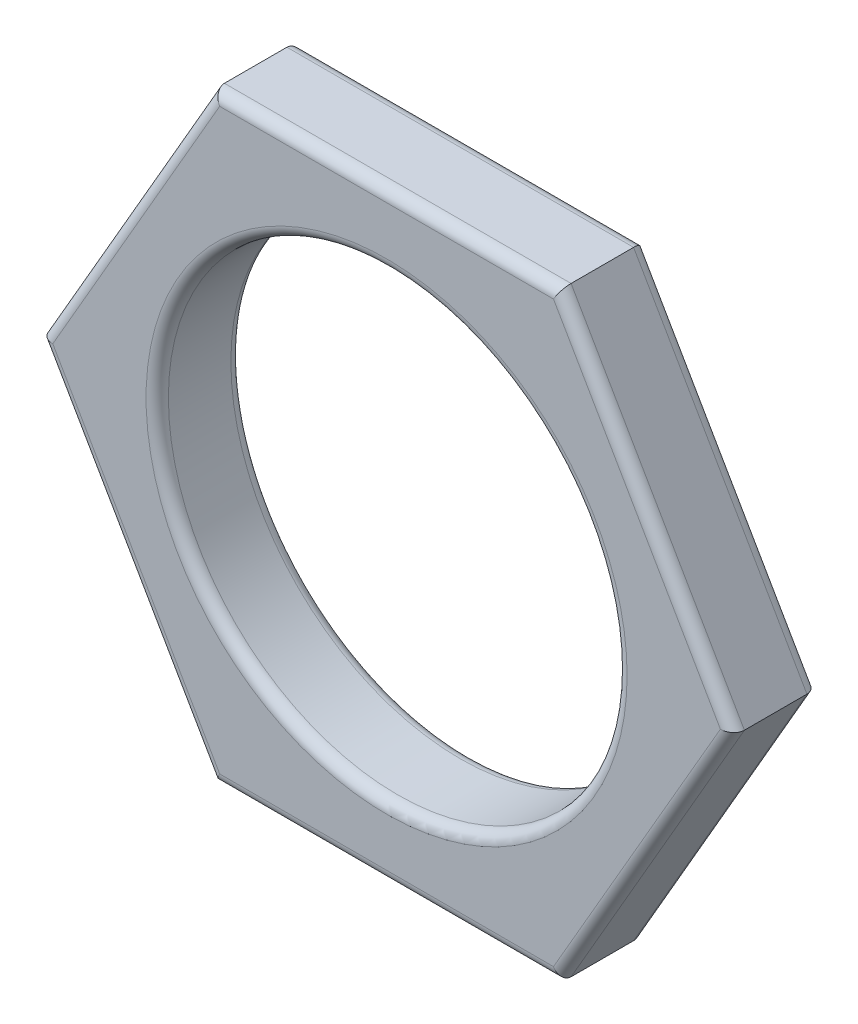
ISO-10303-21;
HEADER;
FILE_DESCRIPTION(('STEP AP214'),'2;1');
FILE_NAME('part.step','',(''),(''),'','','');
FILE_SCHEMA(('AUTOMOTIVE_DESIGN { 1 0 10303 214 1 1 1 1 }'));
ENDSEC;
DATA;
#1=APPLICATION_CONTEXT('core data for automotive mechanical design processes');
#2=APPLICATION_PROTOCOL_DEFINITION('international standard','automotive_design',2000,#1);
#3=PRODUCT_CONTEXT('',#1,'mechanical');
#4=PRODUCT('Part','Part','',(#3));
#5=PRODUCT_RELATED_PRODUCT_CATEGORY('part','',(#4));
#6=PRODUCT_DEFINITION_FORMATION('','',#4);
#7=PRODUCT_DEFINITION_CONTEXT('part definition',#1,'design');
#8=PRODUCT_DEFINITION('design','',#6,#7);
#9=PRODUCT_DEFINITION_SHAPE('','',#8);
#10=(LENGTH_UNIT() NAMED_UNIT(*) SI_UNIT(.MILLI.,.METRE.));
#11=(NAMED_UNIT(*) PLANE_ANGLE_UNIT() SI_UNIT($,.RADIAN.));
#12=(NAMED_UNIT(*) SI_UNIT($,.STERADIAN.) SOLID_ANGLE_UNIT());
#13=UNCERTAINTY_MEASURE_WITH_UNIT(LENGTH_MEASURE(1.E-05),#10,'distance_accuracy_value','');
#14=(GEOMETRIC_REPRESENTATION_CONTEXT(3) GLOBAL_UNCERTAINTY_ASSIGNED_CONTEXT((#13)) GLOBAL_UNIT_ASSIGNED_CONTEXT((#10,
#11,#12)) REPRESENTATION_CONTEXT('',''));
#15=CARTESIAN_POINT('',(0.,0.,0.));
#16=DIRECTION('',(0.,0.,1.));
#17=DIRECTION('',(1.,0.,0.));
#18=AXIS2_PLACEMENT_3D('',#15,#16,#17);
#19=CARTESIAN_POINT('',(0.,0.,1.9));
#20=DIRECTION('',(0.,0.,1.));
#21=DIRECTION('',(1.,0.,0.));
#22=AXIS2_PLACEMENT_3D('',#19,#20,#21);
#23=PLANE('',#22);
#24=CARTESIAN_POINT('',(0.,0.,1.9));
#25=DIRECTION('',(0.,0.,1.));
#26=DIRECTION('',(1.,0.,0.));
#27=AXIS2_PLACEMENT_3D('',#24,#25,#26);
#28=CIRCLE('',#27,10.775);
#29=CARTESIAN_POINT('',(10.775,0.,1.9));
#30=VERTEX_POINT('',#29);
#31=EDGE_CURVE('E11',#30,#30,#28,.F.);
#32=ORIENTED_EDGE('',*,*,#31,.T.);
#33=EDGE_LOOP('',(#32));
#34=FACE_BOUND('',#33,.T.);
#35=DIRECTION('',(-0.500000000000007,0.866025403784435,0.));
#36=VECTOR('',#35,1.);
#37=CARTESIAN_POINT('',(7.33234841870811,13.2,1.9));
#38=LINE('',#37,#36);
#39=CARTESIAN_POINT('',(14.9533719720113,1.03184664516418E-13,1.9));
#40=VERTEX_POINT('',#39);
#41=CARTESIAN_POINT('',(7.47668598600552,12.95,1.9));
#42=VERTEX_POINT('',#41);
#43=EDGE_CURVE('E51',#40,#42,#38,.T.);
#44=ORIENTED_EDGE('',*,*,#43,.T.);
#45=DIRECTION('',(-1.,0.,0.));
#46=VECTOR('',#45,1.);
#47=CARTESIAN_POINT('',(-7.76536112060061,12.9499999999999,1.9));
#48=LINE('',#47,#46);
#49=CARTESIAN_POINT('',(-7.4766859860058,12.9499999999999,1.9));
#50=VERTEX_POINT('',#49);
#51=EDGE_CURVE('E43',#42,#50,#48,.T.);
#52=ORIENTED_EDGE('',*,*,#51,.T.);
#53=DIRECTION('',(-0.499999999999995,-0.866025403784442,0.));
#54=VECTOR('',#53,1.);
#55=CARTESIAN_POINT('',(-15.0977095393087,-0.249999999999997,1.9));
#56=LINE('',#55,#54);
#57=CARTESIAN_POINT('',(-14.9533719720113,0.,1.9));
#58=VERTEX_POINT('',#57);
#59=EDGE_CURVE('E190',#50,#58,#56,.T.);
#60=ORIENTED_EDGE('',*,*,#59,.T.);
#61=DIRECTION('',(0.500000000000001,-0.866025403784438,0.));
#62=VECTOR('',#61,1.);
#63=CARTESIAN_POINT('',(-7.3323484187082,-13.2,1.9));
#64=LINE('',#63,#62);
#65=CARTESIAN_POINT('',(-7.47668598600561,-12.95,1.9));
#66=VERTEX_POINT('',#65);
#67=EDGE_CURVE('E192',#58,#66,#64,.T.);
#68=ORIENTED_EDGE('',*,*,#67,.T.);
#69=DIRECTION('',(1.,0.,0.));
#70=VECTOR('',#69,1.);
#71=CARTESIAN_POINT('',(7.76536112060052,-12.9499999999999,1.9));
#72=LINE('',#71,#70);
#73=CARTESIAN_POINT('',(7.4766859860057,-12.9499999999999,1.9));
#74=VERTEX_POINT('',#73);
#75=EDGE_CURVE('E194',#66,#74,#72,.T.);
#76=ORIENTED_EDGE('',*,*,#75,.T.);
#77=DIRECTION('',(0.499999999999995,0.866025403784442,0.));
#78=VECTOR('',#77,1.);
#79=CARTESIAN_POINT('',(15.0977095393087,0.250000000000108,1.9));
#80=LINE('',#79,#78);
#81=EDGE_CURVE('E56',#74,#40,#80,.T.);
#82=ORIENTED_EDGE('',*,*,#81,.T.);
#83=EDGE_LOOP('',(#44,#52,#60,#68,#76,#82));
#84=FACE_BOUND('',#83,.T.);
#85=ADVANCED_FACE('F34',(#34,#84),#23,.T.);
#86=CARTESIAN_POINT('',(0.,0.,-1.9));
#87=DIRECTION('',(0.,0.,1.));
#88=DIRECTION('',(1.,0.,0.));
#89=AXIS2_PLACEMENT_3D('',#86,#87,#88);
#90=PLANE('',#89);
#91=CARTESIAN_POINT('',(0.,0.,-1.9));
#92=DIRECTION('',(0.,0.,1.));
#93=DIRECTION('',(1.,0.,0.));
#94=AXIS2_PLACEMENT_3D('',#91,#92,#93);
#95=CIRCLE('',#94,10.775);
#96=CARTESIAN_POINT('',(10.775,0.,-1.9));
#97=VERTEX_POINT('',#96);
#98=EDGE_CURVE('E152',#97,#97,#95,.T.);
#99=ORIENTED_EDGE('',*,*,#98,.T.);
#100=EDGE_LOOP('',(#99));
#101=FACE_BOUND('',#100,.T.);
#102=DIRECTION('',(1.,0.,0.));
#103=VECTOR('',#102,1.);
#104=CARTESIAN_POINT('',(0.,-12.95,-1.9));
#105=LINE('',#104,#103);
#106=CARTESIAN_POINT('',(7.4766859860057,-12.9499999999999,-1.9));
#107=VERTEX_POINT('',#106);
#108=CARTESIAN_POINT('',(-7.47668598600561,-12.95,-1.9));
#109=VERTEX_POINT('',#108);
#110=EDGE_CURVE('E151',#107,#109,#105,.F.);
#111=ORIENTED_EDGE('',*,*,#110,.T.);
#112=DIRECTION('',(0.500000000000001,-0.866025403784438,0.));
#113=VECTOR('',#112,1.);
#114=CARTESIAN_POINT('',(-11.2150289790084,-6.475,-1.9));
#115=LINE('',#114,#113);
#116=CARTESIAN_POINT('',(-14.9533719720113,0.,-1.9));
#117=VERTEX_POINT('',#116);
#118=EDGE_CURVE('E130',#109,#117,#115,.F.);
#119=ORIENTED_EDGE('',*,*,#118,.T.);
#120=DIRECTION('',(-0.499999999999995,-0.866025403784442,0.));
#121=VECTOR('',#120,1.);
#122=CARTESIAN_POINT('',(-11.2150289790085,6.47499999999995,-1.9));
#123=LINE('',#122,#121);
#124=CARTESIAN_POINT('',(-7.4766859860058,12.9499999999999,-1.9));
#125=VERTEX_POINT('',#124);
#126=EDGE_CURVE('E140',#117,#125,#123,.F.);
#127=ORIENTED_EDGE('',*,*,#126,.T.);
#128=DIRECTION('',(-1.,0.,0.));
#129=VECTOR('',#128,1.);
#130=CARTESIAN_POINT('',(-1.34521381932275E-13,12.95,-1.9));
#131=LINE('',#130,#129);
#132=CARTESIAN_POINT('',(7.47668598600552,12.95,-1.9));
#133=VERTEX_POINT('',#132);
#134=EDGE_CURVE('E146',#125,#133,#131,.F.);
#135=ORIENTED_EDGE('',*,*,#134,.T.);
#136=DIRECTION('',(-0.500000000000007,0.866025403784435,0.));
#137=VECTOR('',#136,1.);
#138=CARTESIAN_POINT('',(11.2150289790084,6.47500000000008,-1.9));
#139=LINE('',#138,#137);
#140=CARTESIAN_POINT('',(14.9533719720113,1.03618345385412E-13,-1.9));
#141=VERTEX_POINT('',#140);
#142=EDGE_CURVE('E252',#133,#141,#139,.F.);
#143=ORIENTED_EDGE('',*,*,#142,.T.);
#144=DIRECTION('',(0.499999999999995,0.866025403784442,0.));
#145=VECTOR('',#144,1.);
#146=CARTESIAN_POINT('',(11.2150289790085,-6.47499999999992,-1.9));
#147=LINE('',#146,#145);
#148=EDGE_CURVE('E157',#141,#107,#147,.F.);
#149=ORIENTED_EDGE('',*,*,#148,.T.);
#150=EDGE_LOOP('',(#111,#119,#127,#135,#143,#149));
#151=FACE_BOUND('',#150,.T.);
#152=ADVANCED_FACE('F149',(#101,#151),#90,.F.);
#153=CARTESIAN_POINT('',(-7.76536112060061,13.4499999999999,1.9));
#154=DIRECTION('',(0.866025403784442,-0.499999999999995,0.));
#155=DIRECTION('',(0.499999999999995,0.866025403784442,0.));
#156=AXIS2_PLACEMENT_3D('',#153,#154,#155);
#157=PLANE('',#156);
#158=DIRECTION('',(0.,0.,-1.));
#159=VECTOR('',#158,1.);
#160=CARTESIAN_POINT('',(-7.76536112060061,13.4499999999999,1.9));
#161=LINE('',#160,#159);
#162=CARTESIAN_POINT('',(-7.76536112060061,13.4499999999999,1.4));
#163=VERTEX_POINT('',#162);
#164=CARTESIAN_POINT('',(-7.76536112060061,13.4499999999999,-1.4));
#165=VERTEX_POINT('',#164);
#166=EDGE_CURVE('E209',#163,#165,#161,.T.);
#167=ORIENTED_EDGE('',*,*,#166,.T.);
#168=DIRECTION('',(-0.499999999999995,-0.866025403784442,0.));
#169=VECTOR('',#168,1.);
#170=CARTESIAN_POINT('',(-7.76536112060061,13.4499999999999,-1.4));
#171=LINE('',#170,#169);
#172=CARTESIAN_POINT('',(-15.5307222412009,0.,-1.4));
#173=VERTEX_POINT('',#172);
#174=EDGE_CURVE('E188',#165,#173,#171,.T.);
#175=ORIENTED_EDGE('',*,*,#174,.T.);
#176=DIRECTION('',(0.,0.,-1.));
#177=VECTOR('',#176,1.);
#178=CARTESIAN_POINT('',(-15.5307222412009,0.,1.9));
#179=LINE('',#178,#177);
#180=CARTESIAN_POINT('',(-15.5307222412009,0.,1.4));
#181=VERTEX_POINT('',#180);
#182=EDGE_CURVE('E147',#181,#173,#179,.T.);
#183=ORIENTED_EDGE('',*,*,#182,.F.);
#184=DIRECTION('',(-0.499999999999995,-0.866025403784442,0.));
#185=VECTOR('',#184,1.);
#186=CARTESIAN_POINT('',(-7.76536112060061,13.4499999999999,1.4));
#187=LINE('',#186,#185);
#188=EDGE_CURVE('E186',#181,#163,#187,.F.);
#189=ORIENTED_EDGE('',*,*,#188,.T.);
#190=EDGE_LOOP('',(#167,#175,#183,#189));
#191=FACE_BOUND('',#190,.T.);
#192=ADVANCED_FACE('F276',(#191),#157,.F.);
#193=CARTESIAN_POINT('',(-15.5307222412009,0.,1.9));
#194=DIRECTION('',(0.866025403784438,0.500000000000001,0.));
#195=DIRECTION('',(-0.500000000000001,0.866025403784438,0.));
#196=AXIS2_PLACEMENT_3D('',#193,#194,#195);
#197=PLANE('',#196);
#198=ORIENTED_EDGE('',*,*,#182,.T.);
#199=DIRECTION('',(0.500000000000001,-0.866025403784438,0.));
#200=VECTOR('',#199,1.);
#201=CARTESIAN_POINT('',(-15.5307222412009,0.,-1.4));
#202=LINE('',#201,#200);
#203=CARTESIAN_POINT('',(-7.76536112060043,-13.45,-1.4));
#204=VERTEX_POINT('',#203);
#205=EDGE_CURVE('E133',#173,#204,#202,.T.);
#206=ORIENTED_EDGE('',*,*,#205,.T.);
#207=DIRECTION('',(0.,0.,-1.));
#208=VECTOR('',#207,1.);
#209=CARTESIAN_POINT('',(-7.76536112060043,-13.45,1.9));
#210=LINE('',#209,#208);
#211=CARTESIAN_POINT('',(-7.76536112060043,-13.45,1.4));
#212=VERTEX_POINT('',#211);
#213=EDGE_CURVE('E238',#212,#204,#210,.T.);
#214=ORIENTED_EDGE('',*,*,#213,.F.);
#215=DIRECTION('',(0.500000000000001,-0.866025403784438,0.));
#216=VECTOR('',#215,1.);
#217=CARTESIAN_POINT('',(-15.5307222412009,0.,1.4));
#218=LINE('',#217,#216);
#219=EDGE_CURVE('E166',#212,#181,#218,.F.);
#220=ORIENTED_EDGE('',*,*,#219,.T.);
#221=EDGE_LOOP('',(#198,#206,#214,#220));
#222=FACE_BOUND('',#221,.T.);
#223=ADVANCED_FACE('F243',(#222),#197,.F.);
#224=CARTESIAN_POINT('',(-7.76536112060043,-13.45,1.9));
#225=DIRECTION('',(0.,1.,0.));
#226=DIRECTION('',(-1.,0.,0.));
#227=AXIS2_PLACEMENT_3D('',#224,#225,#226);
#228=PLANE('',#227);
#229=ORIENTED_EDGE('',*,*,#213,.T.);
#230=DIRECTION('',(1.,0.,0.));
#231=VECTOR('',#230,1.);
#232=CARTESIAN_POINT('',(-7.76536112060043,-13.45,-1.4));
#233=LINE('',#232,#231);
#234=CARTESIAN_POINT('',(7.76536112060052,-13.4499999999999,-1.4));
#235=VERTEX_POINT('',#234);
#236=EDGE_CURVE('E171',#204,#235,#233,.T.);
#237=ORIENTED_EDGE('',*,*,#236,.T.);
#238=DIRECTION('',(0.,0.,-1.));
#239=VECTOR('',#238,1.);
#240=CARTESIAN_POINT('',(7.76536112060052,-13.4499999999999,1.9));
#241=LINE('',#240,#239);
#242=CARTESIAN_POINT('',(7.76536112060052,-13.4499999999999,1.4));
#243=VERTEX_POINT('',#242);
#244=EDGE_CURVE('E240',#243,#235,#241,.T.);
#245=ORIENTED_EDGE('',*,*,#244,.F.);
#246=DIRECTION('',(1.,0.,0.));
#247=VECTOR('',#246,1.);
#248=CARTESIAN_POINT('',(-7.76536112060043,-13.45,1.4));
#249=LINE('',#248,#247);
#250=EDGE_CURVE('E169',#243,#212,#249,.F.);
#251=ORIENTED_EDGE('',*,*,#250,.T.);
#252=EDGE_LOOP('',(#229,#237,#245,#251));
#253=FACE_BOUND('',#252,.T.);
#254=ADVANCED_FACE('F237',(#253),#228,.F.);
#255=CARTESIAN_POINT('',(7.76536112060052,-13.4499999999999,1.9));
#256=DIRECTION('',(-0.866025403784441,0.499999999999995,0.));
#257=DIRECTION('',(-0.499999999999995,-0.866025403784442,0.));
#258=AXIS2_PLACEMENT_3D('',#255,#256,#257);
#259=PLANE('',#258);
#260=ORIENTED_EDGE('',*,*,#244,.T.);
#261=DIRECTION('',(0.499999999999995,0.866025403784442,0.));
#262=VECTOR('',#261,1.);
#263=CARTESIAN_POINT('',(7.76536112060052,-13.4499999999999,-1.4));
#264=LINE('',#263,#262);
#265=CARTESIAN_POINT('',(15.5307222412009,1.08450453767818E-13,-1.4));
#266=VERTEX_POINT('',#265);
#267=EDGE_CURVE('E175',#235,#266,#264,.T.);
#268=ORIENTED_EDGE('',*,*,#267,.T.);
#269=DIRECTION('',(0.,0.,-1.));
#270=VECTOR('',#269,1.);
#271=CARTESIAN_POINT('',(15.5307222412009,1.08450453767818E-13,1.9));
#272=LINE('',#271,#270);
#273=CARTESIAN_POINT('',(15.5307222412009,1.08450453767818E-13,1.4));
#274=VERTEX_POINT('',#273);
#275=EDGE_CURVE('E247',#274,#266,#272,.T.);
#276=ORIENTED_EDGE('',*,*,#275,.F.);
#277=DIRECTION('',(0.499999999999995,0.866025403784442,0.));
#278=VECTOR('',#277,1.);
#279=CARTESIAN_POINT('',(7.76536112060052,-13.4499999999999,1.4));
#280=LINE('',#279,#278);
#281=EDGE_CURVE('E173',#274,#243,#280,.F.);
#282=ORIENTED_EDGE('',*,*,#281,.T.);
#283=EDGE_LOOP('',(#260,#268,#276,#282));
#284=FACE_BOUND('',#283,.T.);
#285=ADVANCED_FACE('F264',(#284),#259,.F.);
#286=CARTESIAN_POINT('',(15.5307222412009,1.08450453767818E-13,1.9));
#287=DIRECTION('',(-0.866025403784435,-0.500000000000007,0.));
#288=DIRECTION('',(0.500000000000007,-0.866025403784435,0.));
#289=AXIS2_PLACEMENT_3D('',#286,#287,#288);
#290=PLANE('',#289);
#291=ORIENTED_EDGE('',*,*,#275,.T.);
#292=DIRECTION('',(-0.500000000000007,0.866025403784435,0.));
#293=VECTOR('',#292,1.);
#294=CARTESIAN_POINT('',(15.5307222412009,1.08450453767818E-13,-1.4));
#295=LINE('',#294,#293);
#296=CARTESIAN_POINT('',(7.76536112060033,13.4500000000001,-1.4));
#297=VERTEX_POINT('',#296);
#298=EDGE_CURVE('E179',#266,#297,#295,.T.);
#299=ORIENTED_EDGE('',*,*,#298,.T.);
#300=DIRECTION('',(0.,0.,-1.));
#301=VECTOR('',#300,1.);
#302=CARTESIAN_POINT('',(7.76536112060033,13.4500000000001,1.9));
#303=LINE('',#302,#301);
#304=CARTESIAN_POINT('',(7.76536112060033,13.4500000000001,1.4));
#305=VERTEX_POINT('',#304);
#306=EDGE_CURVE('E269',#305,#297,#303,.T.);
#307=ORIENTED_EDGE('',*,*,#306,.F.);
#308=DIRECTION('',(-0.500000000000007,0.866025403784435,0.));
#309=VECTOR('',#308,1.);
#310=CARTESIAN_POINT('',(15.5307222412009,1.06334918890548E-13,1.4));
#311=LINE('',#310,#309);
#312=EDGE_CURVE('E177',#305,#274,#311,.F.);
#313=ORIENTED_EDGE('',*,*,#312,.T.);
#314=EDGE_LOOP('',(#291,#299,#307,#313));
#315=FACE_BOUND('',#314,.T.);
#316=ADVANCED_FACE('F287',(#315),#290,.F.);
#317=CARTESIAN_POINT('',(7.76536112060033,13.4500000000001,1.9));
#318=DIRECTION('',(0.,-1.,0.));
#319=DIRECTION('',(1.,0.,0.));
#320=AXIS2_PLACEMENT_3D('',#317,#318,#319);
#321=PLANE('',#320);
#322=ORIENTED_EDGE('',*,*,#306,.T.);
#323=DIRECTION('',(-1.,0.,0.));
#324=VECTOR('',#323,1.);
#325=CARTESIAN_POINT('',(7.76536112060033,13.4500000000001,-1.4));
#326=LINE('',#325,#324);
#327=EDGE_CURVE('E184',#297,#165,#326,.T.);
#328=ORIENTED_EDGE('',*,*,#327,.T.);
#329=ORIENTED_EDGE('',*,*,#166,.F.);
#330=DIRECTION('',(-1.,0.,0.));
#331=VECTOR('',#330,1.);
#332=CARTESIAN_POINT('',(7.76536112060033,13.4500000000001,1.4));
#333=LINE('',#332,#331);
#334=EDGE_CURVE('E181',#163,#305,#333,.F.);
#335=ORIENTED_EDGE('',*,*,#334,.T.);
#336=EDGE_LOOP('',(#322,#328,#329,#335));
#337=FACE_BOUND('',#336,.T.);
#338=ADVANCED_FACE('F288',(#337),#321,.F.);
#339=CARTESIAN_POINT('',(0.,0.,1.9));
#340=DIRECTION('',(0.,0.,-1.));
#341=DIRECTION('',(-1.,0.,0.));
#342=AXIS2_PLACEMENT_3D('',#339,#340,#341);
#343=CYLINDRICAL_SURFACE('',#342,10.275);
#344=CARTESIAN_POINT('',(0.,0.,-1.4));
#345=DIRECTION('',(0.,0.,1.));
#346=DIRECTION('',(1.,0.,0.));
#347=AXIS2_PLACEMENT_3D('',#344,#345,#346);
#348=CIRCLE('',#347,10.275);
#349=CARTESIAN_POINT('',(-10.275,0.,-1.4));
#350=VERTEX_POINT('',#349);
#351=EDGE_CURVE('E163',#350,#350,#348,.F.);
#352=CARTESIAN_POINT('',(0.,0.,1.4));
#353=DIRECTION('',(0.,0.,1.));
#354=DIRECTION('',(1.,0.,0.));
#355=AXIS2_PLACEMENT_3D('',#352,#353,#354);
#356=CIRCLE('',#355,10.275);
#357=CARTESIAN_POINT('',(-10.275,0.,1.4));
#358=VERTEX_POINT('',#357);
#359=EDGE_CURVE('E155',#358,#358,#356,.T.);
#360=CARTESIAN_POINT('',(-10.275,0.,-1.4));
#361=CARTESIAN_POINT('',(-10.275,0.,-1.37083333333333));
#362=CARTESIAN_POINT('',(-10.275,0.,-1.34166666666667));
#363=CARTESIAN_POINT('',(-10.275,0.,-1.28333333333333));
#364=CARTESIAN_POINT('',(-10.275,0.,-1.25416666666667));
#365=CARTESIAN_POINT('',(-10.275,0.,-1.19583333333333));
#366=CARTESIAN_POINT('',(-10.275,0.,-1.16666666666667));
#367=CARTESIAN_POINT('',(-10.275,0.,-1.10833333333333));
#368=CARTESIAN_POINT('',(-10.275,0.,-1.07916666666667));
#369=CARTESIAN_POINT('',(-10.275,0.,-1.02083333333333));
#370=CARTESIAN_POINT('',(-10.275,0.,-0.991666666666667));
#371=CARTESIAN_POINT('',(-10.275,0.,-0.933333333333334));
#372=CARTESIAN_POINT('',(-10.275,0.,-0.904166666666667));
#373=CARTESIAN_POINT('',(-10.275,0.,-0.845833333333334));
#374=CARTESIAN_POINT('',(-10.275,0.,-0.816666666666667));
#375=CARTESIAN_POINT('',(-10.275,0.,-0.758333333333334));
#376=CARTESIAN_POINT('',(-10.275,0.,-0.729166666666667));
#377=CARTESIAN_POINT('',(-10.275,0.,-0.670833333333334));
#378=CARTESIAN_POINT('',(-10.275,0.,-0.641666666666667));
#379=CARTESIAN_POINT('',(-10.275,0.,-0.583333333333334));
#380=CARTESIAN_POINT('',(-10.275,0.,-0.554166666666667));
#381=CARTESIAN_POINT('',(-10.275,0.,-0.495833333333334));
#382=CARTESIAN_POINT('',(-10.275,0.,-0.466666666666667));
#383=CARTESIAN_POINT('',(-10.275,0.,-0.408333333333333));
#384=CARTESIAN_POINT('',(-10.275,0.,-0.379166666666667));
#385=CARTESIAN_POINT('',(-10.275,0.,-0.320833333333334));
#386=CARTESIAN_POINT('',(-10.275,0.,-0.291666666666667));
#387=CARTESIAN_POINT('',(-10.275,0.,-0.233333333333334));
#388=CARTESIAN_POINT('',(-10.275,0.,-0.204166666666667));
#389=CARTESIAN_POINT('',(-10.275,0.,-0.145833333333333));
#390=CARTESIAN_POINT('',(-10.275,0.,-0.116666666666667));
#391=CARTESIAN_POINT('',(-10.275,0.,-0.0583333333333335));
#392=CARTESIAN_POINT('',(-10.275,0.,-0.029166666666667));
#393=CARTESIAN_POINT('',(-10.275,0.,0.0291666666666662));
#394=CARTESIAN_POINT('',(-10.275,0.,0.0583333333333328));
#395=CARTESIAN_POINT('',(-10.275,0.,0.116666666666666));
#396=CARTESIAN_POINT('',(-10.275,0.,0.145833333333333));
#397=CARTESIAN_POINT('',(-10.275,0.,0.204166666666666));
#398=CARTESIAN_POINT('',(-10.275,0.,0.233333333333333));
#399=CARTESIAN_POINT('',(-10.275,0.,0.291666666666666));
#400=CARTESIAN_POINT('',(-10.275,0.,0.320833333333333));
#401=CARTESIAN_POINT('',(-10.275,0.,0.379166666666666));
#402=CARTESIAN_POINT('',(-10.275,0.,0.408333333333333));
#403=CARTESIAN_POINT('',(-10.275,0.,0.466666666666666));
#404=CARTESIAN_POINT('',(-10.275,0.,0.495833333333333));
#405=CARTESIAN_POINT('',(-10.275,0.,0.554166666666666));
#406=CARTESIAN_POINT('',(-10.275,0.,0.583333333333333));
#407=CARTESIAN_POINT('',(-10.275,0.,0.641666666666666));
#408=CARTESIAN_POINT('',(-10.275,0.,0.670833333333333));
#409=CARTESIAN_POINT('',(-10.275,0.,0.729166666666666));
#410=CARTESIAN_POINT('',(-10.275,0.,0.758333333333333));
#411=CARTESIAN_POINT('',(-10.275,0.,0.816666666666666));
#412=CARTESIAN_POINT('',(-10.275,0.,0.845833333333333));
#413=CARTESIAN_POINT('',(-10.275,0.,0.904166666666666));
#414=CARTESIAN_POINT('',(-10.275,0.,0.933333333333333));
#415=CARTESIAN_POINT('',(-10.275,0.,0.991666666666666));
#416=CARTESIAN_POINT('',(-10.275,0.,1.02083333333333));
#417=CARTESIAN_POINT('',(-10.275,0.,1.07916666666667));
#418=CARTESIAN_POINT('',(-10.275,0.,1.10833333333333));
#419=CARTESIAN_POINT('',(-10.275,0.,1.16666666666667));
#420=CARTESIAN_POINT('',(-10.275,0.,1.19583333333333));
#421=CARTESIAN_POINT('',(-10.275,0.,1.25416666666667));
#422=CARTESIAN_POINT('',(-10.275,0.,1.28333333333333));
#423=CARTESIAN_POINT('',(-10.275,0.,1.34166666666667));
#424=CARTESIAN_POINT('',(-10.275,0.,1.37083333333333));
#425=CARTESIAN_POINT('',(-10.275,0.,1.4));
#426=B_SPLINE_CURVE_WITH_KNOTS('',3,(#360,#361,#362,#363,#364,#365,#366,#367,#368,#369,#370,
#371,#372,#373,#374,#375,#376,#377,#378,#379,#380,#381,#382,#383,#384,#385,#386,#387,#388,#389,
#390,#391,#392,#393,#394,#395,#396,#397,#398,#399,#400,#401,#402,#403,#404,#405,#406,#407,#408,
#409,#410,#411,#412,#413,#414,#415,#416,#417,#418,#419,#420,#421,#422,#423,#424,#425),
.UNSPECIFIED.,.F.,.F.,(4,2,2,2,2,2,2,2,2,2,2,2,2,2,2,2,2,2,2,2,2,2,2,2,2,2,2,2,2,2,2,2,4),(0.,
0.0874999999999999,0.175,0.2625,0.35,0.4375,0.525,0.6125,0.7,0.7875,0.875,0.9625,1.05,1.1375,
1.225,1.3125,1.4,1.4875,1.575,1.6625,1.75,1.8375,1.925,2.0125,2.1,2.1875,2.275,2.3625,2.45,
2.5375,2.625,2.7125,2.8),.UNSPECIFIED.);
#427=EDGE_CURVE('BSEAM307',#350,#358,#426,.T.);
#428=ORIENTED_EDGE('',*,*,#351,.T.);
#429=ORIENTED_EDGE('',*,*,#359,.T.);
#430=ORIENTED_EDGE('',*,*,#427,.T.);
#431=ORIENTED_EDGE('',*,*,#427,.F.);
#432=EDGE_LOOP('',(#428,#430,#429,#431));
#433=FACE_BOUND('',#432,.T.);
#434=ADVANCED_FACE('F307',(#433),#343,.F.);
#435=CARTESIAN_POINT('',(0.,0.,-1.4));
#436=DIRECTION('',(0.,0.,1.));
#437=DIRECTION('',(1.,0.,0.));
#438=AXIS2_PLACEMENT_3D('',#435,#436,#437);
#439=TOROIDAL_SURFACE('',#438,10.775,0.5);
#440=ORIENTED_EDGE('',*,*,#351,.F.);
#441=EDGE_LOOP('',(#440));
#442=FACE_BOUND('',#441,.T.);
#443=ORIENTED_EDGE('',*,*,#98,.F.);
#444=EDGE_LOOP('',(#443));
#445=FACE_BOUND('',#444,.T.);
#446=ADVANCED_FACE('F321',(#442,#445),#439,.T.);
#447=CARTESIAN_POINT('',(15.0977095393087,-0.249999999999895,-1.4));
#448=DIRECTION('',(-0.500000000000007,0.866025403784435,0.));
#449=DIRECTION('',(-0.866025403784435,-0.500000000000007,0.));
#450=AXIS2_PLACEMENT_3D('',#447,#448,#449);
#451=CYLINDRICAL_SURFACE('',#450,0.5);
#452=CARTESIAN_POINT('',(14.9533719720113,1.08582847574423E-13,-1.4));
#453=DIRECTION('',(0.,1.,0.));
#454=DIRECTION('',(-1.,0.,0.));
#455=AXIS2_PLACEMENT_3D('',#452,#453,#454);
#456=ELLIPSE('',#455,0.577350269189626,0.5);
#457=EDGE_CURVE('E203',#141,#266,#456,.F.);
#458=ORIENTED_EDGE('',*,*,#457,.F.);
#459=ORIENTED_EDGE('',*,*,#142,.F.);
#460=CARTESIAN_POINT('',(7.47668598600552,12.95,-1.4));
#461=DIRECTION('',(-0.866025403784443,0.499999999999992,0.));
#462=DIRECTION('',(-0.499999999999992,-0.866025403784443,0.));
#463=AXIS2_PLACEMENT_3D('',#460,#461,#462);
#464=ELLIPSE('',#463,0.577350269189626,0.5);
#465=EDGE_CURVE('E206',#297,#133,#464,.T.);
#466=ORIENTED_EDGE('',*,*,#465,.F.);
#467=ORIENTED_EDGE('',*,*,#298,.F.);
#468=EDGE_LOOP('',(#458,#459,#466,#467));
#469=FACE_BOUND('',#468,.T.);
#470=ADVANCED_FACE('F285',(#469),#451,.T.);
#471=CARTESIAN_POINT('',(7.76536112060034,12.9500000000001,-1.4));
#472=DIRECTION('',(-1.,0.,0.));
#473=DIRECTION('',(0.,-1.,0.));
#474=AXIS2_PLACEMENT_3D('',#471,#472,#473);
#475=CYLINDRICAL_SURFACE('',#474,0.5);
#476=ORIENTED_EDGE('',*,*,#465,.T.);
#477=ORIENTED_EDGE('',*,*,#134,.F.);
#478=CARTESIAN_POINT('',(-7.4766859860058,12.9499999999999,-1.4));
#479=DIRECTION('',(-0.866025403784434,-0.500000000000007,0.));
#480=DIRECTION('',(0.500000000000007,-0.866025403784435,0.));
#481=AXIS2_PLACEMENT_3D('',#478,#479,#480);
#482=ELLIPSE('',#481,0.577350269189625,0.5);
#483=EDGE_CURVE('E143',#165,#125,#482,.T.);
#484=ORIENTED_EDGE('',*,*,#483,.F.);
#485=ORIENTED_EDGE('',*,*,#327,.F.);
#486=EDGE_LOOP('',(#476,#477,#484,#485));
#487=FACE_BOUND('',#486,.T.);
#488=ADVANCED_FACE('F282',(#487),#475,.T.);
#489=CARTESIAN_POINT('',(7.3323484187083,-13.1999999999999,-1.4));
#490=DIRECTION('',(0.499999999999995,0.866025403784442,0.));
#491=DIRECTION('',(-0.866025403784441,0.499999999999995,0.));
#492=AXIS2_PLACEMENT_3D('',#489,#490,#491);
#493=CYLINDRICAL_SURFACE('',#492,0.5);
#494=ORIENTED_EDGE('',*,*,#457,.T.);
#495=ORIENTED_EDGE('',*,*,#267,.F.);
#496=CARTESIAN_POINT('',(7.4766859860057,-12.9499999999999,-1.4));
#497=DIRECTION('',(0.866025403784436,0.500000000000004,0.));
#498=DIRECTION('',(-0.500000000000004,0.866025403784436,0.));
#499=AXIS2_PLACEMENT_3D('',#496,#497,#498);
#500=ELLIPSE('',#499,0.577350269189626,0.5);
#501=EDGE_CURVE('E136',#107,#235,#500,.F.);
#502=ORIENTED_EDGE('',*,*,#501,.F.);
#503=ORIENTED_EDGE('',*,*,#148,.F.);
#504=EDGE_LOOP('',(#494,#495,#502,#503));
#505=FACE_BOUND('',#504,.T.);
#506=ADVANCED_FACE('F259',(#505),#493,.T.);
#507=CARTESIAN_POINT('',(-7.33234841870839,13.1999999999999,-1.4));
#508=DIRECTION('',(-0.499999999999995,-0.866025403784442,0.));
#509=DIRECTION('',(0.866025403784442,-0.499999999999995,0.));
#510=AXIS2_PLACEMENT_3D('',#507,#508,#509);
#511=CYLINDRICAL_SURFACE('',#510,0.5);
#512=ORIENTED_EDGE('',*,*,#483,.T.);
#513=ORIENTED_EDGE('',*,*,#126,.F.);
#514=CARTESIAN_POINT('',(-14.9533719720113,0.,-1.4));
#515=DIRECTION('',(0.,-1.,0.));
#516=DIRECTION('',(-1.,0.,0.));
#517=AXIS2_PLACEMENT_3D('',#514,#515,#516);
#518=ELLIPSE('',#517,0.577350269189625,0.5);
#519=EDGE_CURVE('E126',#173,#117,#518,.T.);
#520=ORIENTED_EDGE('',*,*,#519,.F.);
#521=ORIENTED_EDGE('',*,*,#174,.F.);
#522=EDGE_LOOP('',(#512,#513,#520,#521));
#523=FACE_BOUND('',#522,.T.);
#524=ADVANCED_FACE('F141',(#523),#511,.T.);
#525=CARTESIAN_POINT('',(-7.76536112060043,-12.95,-1.4));
#526=DIRECTION('',(1.,0.,0.));
#527=DIRECTION('',(0.,1.,0.));
#528=AXIS2_PLACEMENT_3D('',#525,#526,#527);
#529=CYLINDRICAL_SURFACE('',#528,0.5);
#530=ORIENTED_EDGE('',*,*,#501,.T.);
#531=ORIENTED_EDGE('',*,*,#236,.F.);
#532=CARTESIAN_POINT('',(-7.47668598600561,-12.95,-1.4));
#533=DIRECTION('',(0.86602540378444,-0.499999999999998,0.));
#534=DIRECTION('',(0.499999999999998,0.86602540378444,0.));
#535=AXIS2_PLACEMENT_3D('',#532,#533,#534);
#536=ELLIPSE('',#535,0.577350269189626,0.5);
#537=EDGE_CURVE('E137',#109,#204,#536,.F.);
#538=ORIENTED_EDGE('',*,*,#537,.F.);
#539=ORIENTED_EDGE('',*,*,#110,.F.);
#540=EDGE_LOOP('',(#530,#531,#538,#539));
#541=FACE_BOUND('',#540,.T.);
#542=ADVANCED_FACE('F262',(#541),#529,.T.);
#543=CARTESIAN_POINT('',(-15.0977095393087,0.25,-1.4));
#544=DIRECTION('',(0.500000000000001,-0.866025403784438,0.));
#545=DIRECTION('',(0.866025403784438,0.500000000000001,0.));
#546=AXIS2_PLACEMENT_3D('',#543,#544,#545);
#547=CYLINDRICAL_SURFACE('',#546,0.5);
#548=ORIENTED_EDGE('',*,*,#519,.T.);
#549=ORIENTED_EDGE('',*,*,#118,.F.);
#550=ORIENTED_EDGE('',*,*,#537,.T.);
#551=ORIENTED_EDGE('',*,*,#205,.F.);
#552=EDGE_LOOP('',(#548,#549,#550,#551));
#553=FACE_BOUND('',#552,.T.);
#554=ADVANCED_FACE('F128',(#553),#547,.T.);
#555=CARTESIAN_POINT('',(0.,0.,1.4));
#556=DIRECTION('',(0.,0.,1.));
#557=DIRECTION('',(1.,0.,0.));
#558=AXIS2_PLACEMENT_3D('',#555,#556,#557);
#559=TOROIDAL_SURFACE('',#558,10.775,0.5);
#560=ORIENTED_EDGE('',*,*,#31,.F.);
#561=EDGE_LOOP('',(#560));
#562=FACE_BOUND('',#561,.T.);
#563=ORIENTED_EDGE('',*,*,#359,.F.);
#564=EDGE_LOOP('',(#563));
#565=FACE_BOUND('',#564,.T.);
#566=ADVANCED_FACE('F327',(#562,#565),#559,.T.);
#567=CARTESIAN_POINT('',(0.,-12.95,1.4));
#568=DIRECTION('',(-1.,0.,0.));
#569=DIRECTION('',(0.,-1.,0.));
#570=AXIS2_PLACEMENT_3D('',#567,#568,#569);
#571=CYLINDRICAL_SURFACE('',#570,0.5);
#572=CARTESIAN_POINT('',(-7.47668598600561,-12.95,1.4));
#573=DIRECTION('',(-0.86602540378444,0.499999999999998,0.));
#574=DIRECTION('',(0.499999999999998,0.86602540378444,0.));
#575=AXIS2_PLACEMENT_3D('',#572,#573,#574);
#576=ELLIPSE('',#575,0.577350269189626,0.5);
#577=EDGE_CURVE('E219',#212,#66,#576,.T.);
#578=ORIENTED_EDGE('',*,*,#577,.F.);
#579=ORIENTED_EDGE('',*,*,#250,.F.);
#580=CARTESIAN_POINT('',(7.4766859860057,-12.9499999999999,1.4));
#581=DIRECTION('',(-0.866025403784436,-0.500000000000004,0.));
#582=DIRECTION('',(-0.500000000000004,0.866025403784436,0.));
#583=AXIS2_PLACEMENT_3D('',#580,#581,#582);
#584=ELLIPSE('',#583,0.577350269189626,0.5);
#585=EDGE_CURVE('E38',#74,#243,#584,.F.);
#586=ORIENTED_EDGE('',*,*,#585,.F.);
#587=ORIENTED_EDGE('',*,*,#75,.F.);
#588=EDGE_LOOP('',(#578,#579,#586,#587));
#589=FACE_BOUND('',#588,.T.);
#590=ADVANCED_FACE('F36',(#589),#571,.T.);
#591=CARTESIAN_POINT('',(11.2150289790085,-6.47499999999992,1.4));
#592=DIRECTION('',(-0.499999999999995,-0.866025403784442,0.));
#593=DIRECTION('',(0.866025403784441,-0.499999999999995,0.));
#594=AXIS2_PLACEMENT_3D('',#591,#592,#593);
#595=CYLINDRICAL_SURFACE('',#594,0.5);
#596=ORIENTED_EDGE('',*,*,#585,.T.);
#597=ORIENTED_EDGE('',*,*,#281,.F.);
#598=CARTESIAN_POINT('',(14.9533719720113,1.01915004213637E-13,1.4));
#599=DIRECTION('',(0.,-1.,0.));
#600=DIRECTION('',(-1.,0.,0.));
#601=AXIS2_PLACEMENT_3D('',#598,#599,#600);
#602=ELLIPSE('',#601,0.577350269189626,0.5);
#603=EDGE_CURVE('E217',#40,#274,#602,.F.);
#604=ORIENTED_EDGE('',*,*,#603,.F.);
#605=ORIENTED_EDGE('',*,*,#81,.F.);
#606=EDGE_LOOP('',(#596,#597,#604,#605));
#607=FACE_BOUND('',#606,.T.);
#608=ADVANCED_FACE('F229',(#607),#595,.T.);
#609=CARTESIAN_POINT('',(-11.2150289790084,-6.475,1.4));
#610=DIRECTION('',(-0.500000000000001,0.866025403784438,0.));
#611=DIRECTION('',(-0.866025403784438,-0.500000000000001,0.));
#612=AXIS2_PLACEMENT_3D('',#609,#610,#611);
#613=CYLINDRICAL_SURFACE('',#612,0.5);
#614=ORIENTED_EDGE('',*,*,#577,.T.);
#615=ORIENTED_EDGE('',*,*,#67,.F.);
#616=CARTESIAN_POINT('',(-14.9533719720113,0.,1.4));
#617=DIRECTION('',(0.,1.,0.));
#618=DIRECTION('',(1.,0.,0.));
#619=AXIS2_PLACEMENT_3D('',#616,#617,#618);
#620=ELLIPSE('',#619,0.577350269189625,0.5);
#621=EDGE_CURVE('E214',#181,#58,#620,.T.);
#622=ORIENTED_EDGE('',*,*,#621,.F.);
#623=ORIENTED_EDGE('',*,*,#219,.F.);
#624=EDGE_LOOP('',(#614,#615,#622,#623));
#625=FACE_BOUND('',#624,.T.);
#626=ADVANCED_FACE('F348',(#625),#613,.T.);
#627=CARTESIAN_POINT('',(11.2150289790084,6.47500000000008,1.4));
#628=DIRECTION('',(0.500000000000007,-0.866025403784435,0.));
#629=DIRECTION('',(0.866025403784435,0.500000000000007,0.));
#630=AXIS2_PLACEMENT_3D('',#627,#628,#629);
#631=CYLINDRICAL_SURFACE('',#630,0.5);
#632=ORIENTED_EDGE('',*,*,#603,.T.);
#633=ORIENTED_EDGE('',*,*,#312,.F.);
#634=CARTESIAN_POINT('',(7.47668598600552,12.95,1.4));
#635=DIRECTION('',(0.866025403784443,-0.499999999999992,0.));
#636=DIRECTION('',(-0.499999999999992,-0.866025403784443,0.));
#637=AXIS2_PLACEMENT_3D('',#634,#635,#636);
#638=ELLIPSE('',#637,0.577350269189626,0.5);
#639=EDGE_CURVE('E212',#42,#305,#638,.F.);
#640=ORIENTED_EDGE('',*,*,#639,.F.);
#641=ORIENTED_EDGE('',*,*,#43,.F.);
#642=EDGE_LOOP('',(#632,#633,#640,#641));
#643=FACE_BOUND('',#642,.T.);
#644=ADVANCED_FACE('F345',(#643),#631,.T.);
#645=CARTESIAN_POINT('',(-11.2150289790085,6.47499999999995,1.4));
#646=DIRECTION('',(0.499999999999995,0.866025403784442,0.));
#647=DIRECTION('',(-0.866025403784442,0.499999999999995,0.));
#648=AXIS2_PLACEMENT_3D('',#645,#646,#647);
#649=CYLINDRICAL_SURFACE('',#648,0.5);
#650=ORIENTED_EDGE('',*,*,#621,.T.);
#651=ORIENTED_EDGE('',*,*,#59,.F.);
#652=CARTESIAN_POINT('',(-7.4766859860058,12.9499999999999,1.4));
#653=DIRECTION('',(0.866025403784434,0.500000000000007,0.));
#654=DIRECTION('',(-0.500000000000007,0.866025403784435,0.));
#655=AXIS2_PLACEMENT_3D('',#652,#653,#654);
#656=ELLIPSE('',#655,0.577350269189625,0.5);
#657=EDGE_CURVE('E210',#163,#50,#656,.T.);
#658=ORIENTED_EDGE('',*,*,#657,.F.);
#659=ORIENTED_EDGE('',*,*,#188,.F.);
#660=EDGE_LOOP('',(#650,#651,#658,#659));
#661=FACE_BOUND('',#660,.T.);
#662=ADVANCED_FACE('F296',(#661),#649,.T.);
#663=CARTESIAN_POINT('',(-1.34521381932275E-13,12.95,1.4));
#664=DIRECTION('',(1.,0.,0.));
#665=DIRECTION('',(0.,1.,0.));
#666=AXIS2_PLACEMENT_3D('',#663,#664,#665);
#667=CYLINDRICAL_SURFACE('',#666,0.5);
#668=ORIENTED_EDGE('',*,*,#639,.T.);
#669=ORIENTED_EDGE('',*,*,#334,.F.);
#670=ORIENTED_EDGE('',*,*,#657,.T.);
#671=ORIENTED_EDGE('',*,*,#51,.F.);
#672=EDGE_LOOP('',(#668,#669,#670,#671));
#673=FACE_BOUND('',#672,.T.);
#674=ADVANCED_FACE('F291',(#673),#667,.T.);
#675=CLOSED_SHELL('',(#85,#152,#192,#223,#254,#285,#316,#338,#434,#446,#470,#488,#506,#524,#542,
#554,#566,#590,#608,#626,#644,#662,#674));
#676=MANIFOLD_SOLID_BREP('B2',#675);
#677=ADVANCED_BREP_SHAPE_REPRESENTATION('',(#18,#676),#14);
#678=SHAPE_DEFINITION_REPRESENTATION(#9,#677);
ENDSEC;
END-ISO-10303-21;
